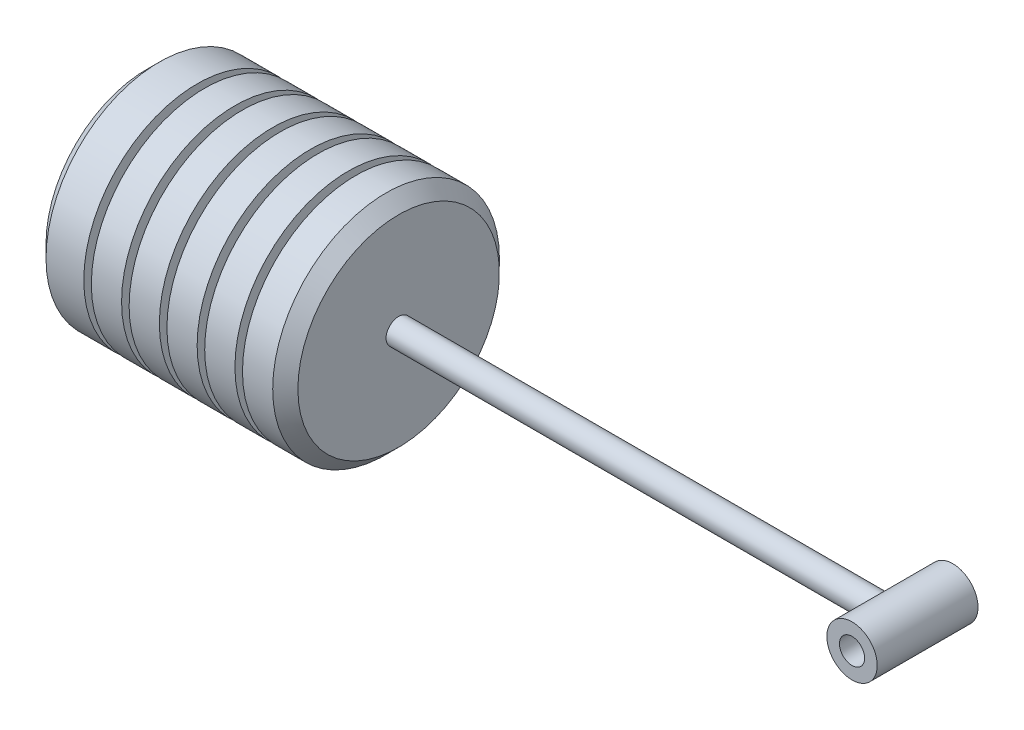
ISO-10303-21;
HEADER;
FILE_DESCRIPTION(('STEP AP214'),'2;1');
FILE_NAME('part.step','',(''),(''),'','','');
FILE_SCHEMA(('AUTOMOTIVE_DESIGN { 1 0 10303 214 1 1 1 1 }'));
ENDSEC;
DATA;
#1=APPLICATION_CONTEXT('core data for automotive mechanical design processes');
#2=APPLICATION_PROTOCOL_DEFINITION('international standard','automotive_design',2000,#1);
#3=PRODUCT_CONTEXT('',#1,'mechanical');
#4=PRODUCT('Part','Part','',(#3));
#5=PRODUCT_RELATED_PRODUCT_CATEGORY('part','',(#4));
#6=PRODUCT_DEFINITION_FORMATION('','',#4);
#7=PRODUCT_DEFINITION_CONTEXT('part definition',#1,'design');
#8=PRODUCT_DEFINITION('design','',#6,#7);
#9=PRODUCT_DEFINITION_SHAPE('','',#8);
#10=(LENGTH_UNIT() NAMED_UNIT(*) SI_UNIT(.MILLI.,.METRE.));
#11=(NAMED_UNIT(*) PLANE_ANGLE_UNIT() SI_UNIT($,.RADIAN.));
#12=(NAMED_UNIT(*) SI_UNIT($,.STERADIAN.) SOLID_ANGLE_UNIT());
#13=UNCERTAINTY_MEASURE_WITH_UNIT(LENGTH_MEASURE(1.E-05),#10,'distance_accuracy_value','');
#14=(GEOMETRIC_REPRESENTATION_CONTEXT(3) GLOBAL_UNCERTAINTY_ASSIGNED_CONTEXT((#13)) GLOBAL_UNIT_ASSIGNED_CONTEXT((#10,
#11,#12)) REPRESENTATION_CONTEXT('',''));
#15=CARTESIAN_POINT('',(0.,0.,0.));
#16=DIRECTION('',(0.,0.,1.));
#17=DIRECTION('',(1.,0.,0.));
#18=AXIS2_PLACEMENT_3D('',#15,#16,#17);
#19=CARTESIAN_POINT('',(300.,0.,0.));
#20=DIRECTION('',(-1.,0.,0.));
#21=DIRECTION('',(0.,0.,1.));
#22=AXIS2_PLACEMENT_3D('',#19,#20,#21);
#23=CYLINDRICAL_SURFACE('',#22,5.);
#24=CARTESIAN_POINT('',(100.,0.,0.));
#25=DIRECTION('',(-1.,0.,0.));
#26=DIRECTION('',(0.,0.,1.));
#27=AXIS2_PLACEMENT_3D('',#24,#25,#26);
#28=CIRCLE('',#27,5.);
#29=CARTESIAN_POINT('',(100.,0.,5.));
#30=VERTEX_POINT('',#29);
#31=EDGE_CURVE('E44',#30,#30,#28,.F.);
#32=ORIENTED_EDGE('',*,*,#31,.T.);
#33=EDGE_LOOP('',(#32));
#34=FACE_BOUND('',#33,.T.);
#35=CARTESIAN_POINT('',(290.,0.,5.));
#36=CARTESIAN_POINT('',(290.000000398281,-0.131488890078726,4.99999956778397));
#37=CARTESIAN_POINT('',(290.002599468787,-0.262986970217147,4.99480722471488));
#38=CARTESIAN_POINT('',(290.012930221648,-0.525014586348051,4.97409710588797));
#39=CARTESIAN_POINT('',(290.020664136851,-0.655543676003291,4.95857483823602));
#40=CARTESIAN_POINT('',(290.04107933031,-0.91478320343113,4.91735922052266));
#41=CARTESIAN_POINT('',(290.053767663571,-1.04349077535257,4.89165136559376));
#42=CARTESIAN_POINT('',(290.083772834233,-1.29802636754292,4.83034932743654));
#43=CARTESIAN_POINT('',(290.101091563696,-1.42385318781692,4.79475110259437));
#44=CARTESIAN_POINT('',(290.139845698452,-1.67121386584966,4.71422151754871));
#45=CARTESIAN_POINT('',(290.161262903292,-1.7927639909456,4.66933135145196));
#46=CARTESIAN_POINT('',(290.207755725107,-2.03144447751189,4.57055120219306));
#47=CARTESIAN_POINT('',(290.232832718532,-2.14857315511665,4.51665783180655));
#48=CARTESIAN_POINT('',(290.312691395113,-2.49222561412914,4.34220037106102));
#49=CARTESIAN_POINT('',(290.372145397838,-2.71128846115303,4.20876922675994));
#50=CARTESIAN_POINT('',(290.502193365758,-3.13758045755123,3.90239471875545));
#51=CARTESIAN_POINT('',(290.573243673287,-3.34329192972867,3.72754930972028));
#52=CARTESIAN_POINT('',(290.716997855248,-3.72388133818108,3.34741091171684));
#53=CARTESIAN_POINT('',(290.789702942565,-3.89873577832563,3.14209493801615));
#54=CARTESIAN_POINT('',(290.93506132667,-4.22628385620055,2.68752485253572));
#55=CARTESIAN_POINT('',(291.007273358297,-4.37620734766694,2.43609810868251));
#56=CARTESIAN_POINT('',(291.103625824533,-4.56723365243868,2.0400819556324));
#57=CARTESIAN_POINT('',(291.133757203153,-4.62527981130998,1.90488170943973));
#58=CARTESIAN_POINT('',(291.188903883728,-4.72948843578257,1.62899874822594));
#59=CARTESIAN_POINT('',(291.21392221298,-4.77565793744269,1.48831933636083));
#60=CARTESIAN_POINT('',(291.256494376379,-4.8531380584616,1.21100724584403));
#61=CARTESIAN_POINT('',(291.274402958911,-4.88516762296958,1.07462952002207));
#62=CARTESIAN_POINT('',(291.304036662889,-4.93772573892405,0.79907430252038));
#63=CARTESIAN_POINT('',(291.315765064848,-4.95826039236648,0.659898336993895));
#64=CARTESIAN_POINT('',(291.33253838913,-4.98752398958936,0.379992538888765));
#65=CARTESIAN_POINT('',(291.337587336507,-4.99626004329765,0.239263693685899));
#66=CARTESIAN_POINT('',(291.340787003611,-5.00180399494055,-0.0425011762896027));
#67=CARTESIAN_POINT('',(291.338938381488,-4.99861303092504,-0.183537170471377));
#68=CARTESIAN_POINT('',(291.329062728264,-4.98145803092846,-0.447703572876945));
#69=CARTESIAN_POINT('',(291.321803364989,-4.96883208371091,-0.570952602810193));
#70=CARTESIAN_POINT('',(291.302260930034,-4.93454402662215,-0.815821213967095));
#71=CARTESIAN_POINT('',(291.289976280537,-4.91287907868334,-0.937440271021929));
#72=CARTESIAN_POINT('',(291.260785204231,-4.86076278292654,-1.17819787431275));
#73=CARTESIAN_POINT('',(291.243879348044,-4.83031251988905,-1.29733672485001));
#74=CARTESIAN_POINT('',(291.205969260154,-4.76094319159974,-1.53247137695438));
#75=CARTESIAN_POINT('',(291.184963418347,-4.72202079856858,-1.64846592327606));
#76=CARTESIAN_POINT('',(291.115639675784,-4.59108661358502,-1.99600687161863));
#77=CARTESIAN_POINT('',(291.061712081665,-4.48608785825887,-2.22169335603785));
#78=CARTESIAN_POINT('',(290.944825669214,-4.24519591002764,-2.65321011822285));
#79=CARTESIAN_POINT('',(290.88186279899,-4.10928884013355,-2.85903141775921));
#80=CARTESIAN_POINT('',(290.744345442409,-3.79034422310329,-3.27258852820379));
#81=CARTESIAN_POINT('',(290.669333457969,-3.60351571642877,-3.47725800770729));
#82=CARTESIAN_POINT('',(290.5226098609,-3.19773444843253,-3.85370346568872));
#83=CARTESIAN_POINT('',(290.450899837942,-2.97876642220598,-4.02546372382122));
#84=CARTESIAN_POINT('',(290.349654934178,-2.62430600098781,-4.25844089711319));
#85=CARTESIAN_POINT('',(290.316296197258,-2.49871002336159,-4.33335209514551));
#86=CARTESIAN_POINT('',(290.253369472815,-2.2407106014256,-4.47220820297243));
#87=CARTESIAN_POINT('',(290.223799888642,-2.1083100575541,-4.53615773559115));
#88=CARTESIAN_POINT('',(290.169324464895,-1.83762803314805,-4.65239887538338));
#89=CARTESIAN_POINT('',(290.144416748551,-1.6993489468218,-4.70469517552479));
#90=CARTESIAN_POINT('',(290.100009735425,-1.41791187896084,-4.79702492907996));
#91=CARTESIAN_POINT('',(290.080509816496,-1.27475446078988,-4.83705979318215));
#92=CARTESIAN_POINT('',(290.048904026718,-0.996798015430421,-4.90153356350301));
#93=CARTESIAN_POINT('',(290.036319536657,-0.862288674029806,-4.92698951540243));
#94=CARTESIAN_POINT('',(290.016569642677,-0.591248360012475,-4.9668080412236));
#95=CARTESIAN_POINT('',(290.009403759718,-0.454717567193961,-4.98117159579009));
#96=CARTESIAN_POINT('',(290.000696195126,-0.180810709359656,-4.99861316203406));
#97=CARTESIAN_POINT('',(289.999152360327,-0.0434349881359083,-5.00169549426692));
#98=CARTESIAN_POINT('',(290.00172762141,0.231047608581543,-4.99654442608125));
#99=CARTESIAN_POINT('',(290.005846466674,0.368154495704333,-4.98831152645069));
#100=CARTESIAN_POINT('',(290.019090269176,0.630324023952241,-4.96172132615896));
#101=CARTESIAN_POINT('',(290.027800777569,0.755493751243217,-4.94420162240662));
#102=CARTESIAN_POINT('',(290.049727726473,1.00380426086804,-4.89982552642939));
#103=CARTESIAN_POINT('',(290.062945594164,1.12694438760007,-4.87296617690675));
#104=CARTESIAN_POINT('',(290.093575495959,1.37032307172126,-4.81019731663748));
#105=CARTESIAN_POINT('',(290.110986246537,1.49056250470176,-4.77429057532187));
#106=CARTESIAN_POINT('',(290.149606318511,1.72747946867538,-4.69377183867682));
#107=CARTESIAN_POINT('',(290.170817094759,1.84415561535681,-4.64915650864734));
#108=CARTESIAN_POINT('',(290.240771235834,2.19430354472275,-4.5000521931497));
#109=CARTESIAN_POINT('',(290.294950955218,2.42111320848944,-4.38205925821493));
#110=CARTESIAN_POINT('',(290.412806242544,2.8523456015808,-4.1144478067803));
#111=CARTESIAN_POINT('',(290.476485852236,3.05675873773467,-3.96481581800768));
#112=CARTESIAN_POINT('',(290.614584946079,3.45882132675026,-3.62121270896337));
#113=CARTESIAN_POINT('',(290.68944500638,3.65383533419946,-3.42433040824756));
#114=CARTESIAN_POINT('',(290.836891182409,4.00930667677967,-3.00032946286605));
#115=CARTESIAN_POINT('',(290.909475695627,4.16974010650665,-2.77319007600167));
#116=CARTESIAN_POINT('',(291.012147394174,4.38466016919211,-2.40750943377074));
#117=CARTESIAN_POINT('',(291.046040447586,4.4532676226712,-2.27814912545652));
#118=CARTESIAN_POINT('',(291.109776475849,4.57918112262684,-2.01310589922103));
#119=CARTESIAN_POINT('',(291.139621283196,4.63649228788887,-1.87742587962409));
#120=CARTESIAN_POINT('',(291.194096726344,4.73913999074898,-1.60072296467478));
#121=CARTESIAN_POINT('',(291.218731620053,4.78448631442401,-1.45970454424997));
#122=CARTESIAN_POINT('',(291.261771809018,4.86265004333096,-1.17330895717519));
#123=CARTESIAN_POINT('',(291.280178068782,4.89546938847111,-1.02793246917246));
#124=CARTESIAN_POINT('',(291.308487243286,4.94553834792943,-0.748235018464724));
#125=CARTESIAN_POINT('',(291.319036729647,4.96397997433445,-0.614192116880048));
#126=CARTESIAN_POINT('',(291.333931754604,4.98993873206133,-0.344714754302618));
#127=CARTESIAN_POINT('',(291.338277943202,4.99745700797003,-0.209280440604789));
#128=CARTESIAN_POINT('',(291.340585743433,5.00145477351748,0.0617569250046245));
#129=CARTESIAN_POINT('',(291.338549599237,4.99793814327599,0.197359900849616));
#130=CARTESIAN_POINT('',(291.328183182142,4.97992974203946,0.467585557947869));
#131=CARTESIAN_POINT('',(291.319853166912,4.96543842034336,0.602208279104529));
#132=CARTESIAN_POINT('',(291.298321712552,4.92759757627216,0.856560202159008));
#133=CARTESIAN_POINT('',(291.285662290912,4.90522766015001,0.976482559623924));
#134=CARTESIAN_POINT('',(291.255884005195,4.85194376743194,1.21386119056747));
#135=CARTESIAN_POINT('',(291.238763762184,4.82102714868723,1.33131668933404));
#136=CARTESIAN_POINT('',(291.181457681313,4.71590306073959,1.6789171151129));
#137=CARTESIAN_POINT('',(291.135311862289,4.62929708984156,1.904456094986));
#138=CARTESIAN_POINT('',(291.028571090454,4.41907164675021,2.35316034231251));
#139=CARTESIAN_POINT('',(290.967213663526,4.29335633682032,2.57514807598934));
#140=CARTESIAN_POINT('',(290.838233635048,4.01075421010745,2.99636410959571));
#141=CARTESIAN_POINT('',(290.770607783796,3.85385117607732,3.19558048344416));
#142=CARTESIAN_POINT('',(290.626885553992,3.49102748964406,3.59070785847071));
#143=CARTESIAN_POINT('',(290.550758370941,3.281467363426,3.78327601876761));
#144=CARTESIAN_POINT('',(290.406104850285,2.83072875767415,4.13133442118327));
#145=CARTESIAN_POINT('',(290.33758262024,2.58953334336126,4.28680467774357));
#146=CARTESIAN_POINT('',(290.245809866242,2.20753881885373,4.48863041452683));
#147=CARTESIAN_POINT('',(290.216957900197,2.0762551257027,4.55086707940638));
#148=CARTESIAN_POINT('',(290.163852547654,1.80799529933998,4.66393615612038));
#149=CARTESIAN_POINT('',(290.13959690292,1.6710220020515,4.71477417053062));
#150=CARTESIAN_POINT('',(290.096455158713,1.39269501068687,4.80434543836719));
#151=CARTESIAN_POINT('',(290.077557356206,1.2513516234708,4.84310509298771));
#152=CARTESIAN_POINT('',(290.04565381888,0.965237205795552,4.90813759626857));
#153=CARTESIAN_POINT('',(290.032644485103,0.820468326048369,4.93441807252704));
#154=CARTESIAN_POINT('',(290.015236121213,0.563041654408156,4.96947453199886));
#155=CARTESIAN_POINT('',(290.009532583983,0.450825809730021,4.98091175369202));
#156=CARTESIAN_POINT('',(290.00191430014,0.225742246050263,4.99617477825015));
#157=CARTESIAN_POINT('',(289.999999658102,0.112874509142187,5.00000037102885));
#158=CARTESIAN_POINT('',(290.,0.,5.));
#159=B_SPLINE_CURVE_WITH_KNOTS('',3,(#35,#36,#37,#38,#39,#40,#41,#42,#43,#44,#45,#46,#47,#48,
#49,#50,#51,#52,#53,#54,#55,#56,#57,#58,#59,#60,#61,#62,#63,#64,#65,#66,#67,#68,#69,#70,#71,#72,
#73,#74,#75,#76,#77,#78,#79,#80,#81,#82,#83,#84,#85,#86,#87,#88,#89,#90,#91,#92,#93,#94,#95,#96,
#97,#98,#99,#100,#101,#102,#103,#104,#105,#106,#107,#108,#109,#110,#111,#112,#113,#114,#115,
#116,#117,#118,#119,#120,#121,#122,#123,#124,#125,#126,#127,#128,#129,#130,#131,#132,#133,#134,
#135,#136,#137,#138,#139,#140,#141,#142,#143,#144,#145,#146,#147,#148,#149,#150,#151,#152,#153,
#154,#155,#156,#157,#158),.UNSPECIFIED.,.T.,.F.,(4,2,2,2,2,2,2,2,2,2,2,2,2,2,2,2,2,2,2,2,2,2,2,
2,2,2,2,2,2,2,2,2,2,2,2,2,2,2,2,2,2,2,2,2,2,2,2,2,2,2,2,2,2,2,2,2,2,2,2,2,2,4),(0.,
0.394355294649885,0.788882184037812,1.18397293369034,1.57922537181693,1.9727616853054,
2.36644639154632,3.15295441699266,3.98704440767527,4.82176680235501,5.72122193562247,
6.17125359989459,6.62101803579305,7.04410338623952,7.46696393118358,7.88956954321097,
8.31213483216671,8.68401534897462,9.05601271689167,9.42796417149683,9.8000619899096,
10.56083380205,11.3219478566368,12.1795688603196,13.03759852356,13.4870830845772,
13.9363776171859,14.3854908824167,14.8345524573652,15.2464230691107,15.6582572644723,
16.0699337163998,16.4815919489941,16.8612200640511,17.240968493866,17.6206008225791,
18.0003788066131,18.7808755264614,19.5617052624835,20.4192132572739,21.2773121558255,
21.7277011924366,22.1778856687596,22.6277007885002,23.0774462222894,23.4840267197959,
23.8905646113036,24.2969595710184,24.703337894006,25.0708552370355,25.4384863225851,
26.1732662495599,26.9574126491567,27.7419678673239,28.6218519479817,29.5022089791541,
29.9460734671028,30.3897193096444,30.8323885049027,31.2747867798493,31.6133053554877,
31.9518332743451),.UNSPECIFIED.);
#160=CARTESIAN_POINT('',(290.,0.,5.));
#161=VERTEX_POINT('',#160);
#162=EDGE_CURVE('E10',#161,#161,#159,.T.);
#163=ORIENTED_EDGE('',*,*,#162,.F.);
#164=EDGE_LOOP('',(#163));
#165=FACE_BOUND('',#164,.T.);
#166=ADVANCED_FACE('F33',(#34,#165),#23,.T.);
#167=CARTESIAN_POINT('',(0.,0.,0.));
#168=DIRECTION('',(1.,0.,0.));
#169=DIRECTION('',(0.,0.,-1.));
#170=AXIS2_PLACEMENT_3D('',#167,#168,#169);
#171=PLANE('',#170);
#172=CARTESIAN_POINT('',(0.,0.,0.));
#173=DIRECTION('',(-1.,0.,0.));
#174=DIRECTION('',(0.,0.,1.));
#175=AXIS2_PLACEMENT_3D('',#172,#173,#174);
#176=CIRCLE('',#175,40.);
#177=CARTESIAN_POINT('',(0.,0.,40.));
#178=VERTEX_POINT('',#177);
#179=EDGE_CURVE('E48',#178,#178,#176,.T.);
#180=ORIENTED_EDGE('',*,*,#179,.T.);
#181=EDGE_LOOP('',(#180));
#182=FACE_BOUND('',#181,.T.);
#183=ADVANCED_FACE('F35',(#182),#171,.F.);
#184=CARTESIAN_POINT('',(5.,0.,0.));
#185=DIRECTION('',(1.,0.,0.));
#186=DIRECTION('',(0.,0.,-1.));
#187=AXIS2_PLACEMENT_3D('',#184,#185,#186);
#188=CONICAL_SURFACE('',#187,45.,0.785398163397448);
#189=ORIENTED_EDGE('',*,*,#179,.F.);
#190=EDGE_LOOP('',(#189));
#191=FACE_BOUND('',#190,.T.);
#192=CARTESIAN_POINT('',(5.,0.,0.));
#193=DIRECTION('',(-1.,0.,0.));
#194=DIRECTION('',(0.,0.,1.));
#195=AXIS2_PLACEMENT_3D('',#192,#193,#194);
#196=CIRCLE('',#195,45.);
#197=CARTESIAN_POINT('',(5.,0.,45.));
#198=VERTEX_POINT('',#197);
#199=EDGE_CURVE('E52',#198,#198,#196,.T.);
#200=ORIENTED_EDGE('',*,*,#199,.T.);
#201=EDGE_LOOP('',(#200));
#202=FACE_BOUND('',#201,.T.);
#203=ADVANCED_FACE('F162',(#191,#202),#188,.T.);
#204=CARTESIAN_POINT('',(-82.8620689655173,0.,0.));
#205=DIRECTION('',(-1.,0.,0.));
#206=DIRECTION('',(0.,0.,1.));
#207=AXIS2_PLACEMENT_3D('',#204,#205,#206);
#208=CYLINDRICAL_SURFACE('',#207,45.);
#209=ORIENTED_EDGE('',*,*,#199,.F.);
#210=EDGE_LOOP('',(#209));
#211=FACE_BOUND('',#210,.T.);
#212=CARTESIAN_POINT('',(20.,0.,0.));
#213=DIRECTION('',(-1.,0.,0.));
#214=DIRECTION('',(0.,0.,1.));
#215=AXIS2_PLACEMENT_3D('',#212,#213,#214);
#216=CIRCLE('',#215,45.);
#217=CARTESIAN_POINT('',(20.,0.,45.));
#218=VERTEX_POINT('',#217);
#219=EDGE_CURVE('E57',#218,#218,#216,.T.);
#220=ORIENTED_EDGE('',*,*,#219,.T.);
#221=EDGE_LOOP('',(#220));
#222=FACE_BOUND('',#221,.T.);
#223=ADVANCED_FACE('F249',(#211,#222),#208,.T.);
#224=CARTESIAN_POINT('',(20.,45.,0.));
#225=DIRECTION('',(-1.,0.,0.));
#226=DIRECTION('',(0.,0.,1.));
#227=AXIS2_PLACEMENT_3D('',#224,#225,#226);
#228=PLANE('',#227);
#229=ORIENTED_EDGE('',*,*,#219,.F.);
#230=EDGE_LOOP('',(#229));
#231=FACE_BOUND('',#230,.T.);
#232=CARTESIAN_POINT('',(20.,0.,0.));
#233=DIRECTION('',(-1.,0.,0.));
#234=DIRECTION('',(0.,0.,1.));
#235=AXIS2_PLACEMENT_3D('',#232,#233,#234);
#236=CIRCLE('',#235,40.);
#237=CARTESIAN_POINT('',(20.,0.,40.));
#238=VERTEX_POINT('',#237);
#239=EDGE_CURVE('E60',#238,#238,#236,.T.);
#240=ORIENTED_EDGE('',*,*,#239,.T.);
#241=EDGE_LOOP('',(#240));
#242=FACE_BOUND('',#241,.T.);
#243=ADVANCED_FACE('F245',(#231,#242),#228,.F.);
#244=CARTESIAN_POINT('',(-82.8620689655173,0.,0.));
#245=DIRECTION('',(-1.,0.,0.));
#246=DIRECTION('',(0.,0.,1.));
#247=AXIS2_PLACEMENT_3D('',#244,#245,#246);
#248=CYLINDRICAL_SURFACE('',#247,40.);
#249=ORIENTED_EDGE('',*,*,#239,.F.);
#250=EDGE_LOOP('',(#249));
#251=FACE_BOUND('',#250,.T.);
#252=CARTESIAN_POINT('',(23.,0.,0.));
#253=DIRECTION('',(-1.,0.,0.));
#254=DIRECTION('',(0.,0.,1.));
#255=AXIS2_PLACEMENT_3D('',#252,#253,#254);
#256=CIRCLE('',#255,40.);
#257=CARTESIAN_POINT('',(23.,0.,40.));
#258=VERTEX_POINT('',#257);
#259=EDGE_CURVE('E63',#258,#258,#256,.T.);
#260=ORIENTED_EDGE('',*,*,#259,.T.);
#261=EDGE_LOOP('',(#260));
#262=FACE_BOUND('',#261,.T.);
#263=ADVANCED_FACE('F241',(#251,#262),#248,.T.);
#264=CARTESIAN_POINT('',(23.,40.,0.));
#265=DIRECTION('',(1.,0.,0.));
#266=DIRECTION('',(0.,0.,-1.));
#267=AXIS2_PLACEMENT_3D('',#264,#265,#266);
#268=PLANE('',#267);
#269=ORIENTED_EDGE('',*,*,#259,.F.);
#270=EDGE_LOOP('',(#269));
#271=FACE_BOUND('',#270,.T.);
#272=CARTESIAN_POINT('',(23.,0.,0.));
#273=DIRECTION('',(-1.,0.,0.));
#274=DIRECTION('',(0.,0.,1.));
#275=AXIS2_PLACEMENT_3D('',#272,#273,#274);
#276=CIRCLE('',#275,45.);
#277=CARTESIAN_POINT('',(23.,0.,45.));
#278=VERTEX_POINT('',#277);
#279=EDGE_CURVE('E66',#278,#278,#276,.T.);
#280=ORIENTED_EDGE('',*,*,#279,.T.);
#281=EDGE_LOOP('',(#280));
#282=FACE_BOUND('',#281,.T.);
#283=ADVANCED_FACE('F237',(#271,#282),#268,.F.);
#284=CARTESIAN_POINT('',(-82.8620689655173,0.,0.));
#285=DIRECTION('',(-1.,0.,0.));
#286=DIRECTION('',(0.,0.,1.));
#287=AXIS2_PLACEMENT_3D('',#284,#285,#286);
#288=CYLINDRICAL_SURFACE('',#287,45.);
#289=ORIENTED_EDGE('',*,*,#279,.F.);
#290=EDGE_LOOP('',(#289));
#291=FACE_BOUND('',#290,.T.);
#292=CARTESIAN_POINT('',(35.,0.,0.));
#293=DIRECTION('',(-1.,0.,0.));
#294=DIRECTION('',(0.,0.,1.));
#295=AXIS2_PLACEMENT_3D('',#292,#293,#294);
#296=CIRCLE('',#295,45.);
#297=CARTESIAN_POINT('',(35.,0.,45.));
#298=VERTEX_POINT('',#297);
#299=EDGE_CURVE('E69',#298,#298,#296,.T.);
#300=ORIENTED_EDGE('',*,*,#299,.T.);
#301=EDGE_LOOP('',(#300));
#302=FACE_BOUND('',#301,.T.);
#303=ADVANCED_FACE('F233',(#291,#302),#288,.T.);
#304=CARTESIAN_POINT('',(35.,45.,0.));
#305=DIRECTION('',(-1.,0.,0.));
#306=DIRECTION('',(0.,0.,1.));
#307=AXIS2_PLACEMENT_3D('',#304,#305,#306);
#308=PLANE('',#307);
#309=ORIENTED_EDGE('',*,*,#299,.F.);
#310=EDGE_LOOP('',(#309));
#311=FACE_BOUND('',#310,.T.);
#312=CARTESIAN_POINT('',(35.,0.,0.));
#313=DIRECTION('',(-1.,0.,0.));
#314=DIRECTION('',(0.,0.,1.));
#315=AXIS2_PLACEMENT_3D('',#312,#313,#314);
#316=CIRCLE('',#315,40.);
#317=CARTESIAN_POINT('',(35.,0.,40.));
#318=VERTEX_POINT('',#317);
#319=EDGE_CURVE('E72',#318,#318,#316,.T.);
#320=ORIENTED_EDGE('',*,*,#319,.T.);
#321=EDGE_LOOP('',(#320));
#322=FACE_BOUND('',#321,.T.);
#323=ADVANCED_FACE('F229',(#311,#322),#308,.F.);
#324=CARTESIAN_POINT('',(-82.8620689655173,0.,0.));
#325=DIRECTION('',(-1.,0.,0.));
#326=DIRECTION('',(0.,0.,1.));
#327=AXIS2_PLACEMENT_3D('',#324,#325,#326);
#328=CYLINDRICAL_SURFACE('',#327,40.);
#329=ORIENTED_EDGE('',*,*,#319,.F.);
#330=EDGE_LOOP('',(#329));
#331=FACE_BOUND('',#330,.T.);
#332=CARTESIAN_POINT('',(38.,0.,0.));
#333=DIRECTION('',(-1.,0.,0.));
#334=DIRECTION('',(0.,0.,1.));
#335=AXIS2_PLACEMENT_3D('',#332,#333,#334);
#336=CIRCLE('',#335,40.);
#337=CARTESIAN_POINT('',(38.,0.,40.));
#338=VERTEX_POINT('',#337);
#339=EDGE_CURVE('E75',#338,#338,#336,.T.);
#340=ORIENTED_EDGE('',*,*,#339,.T.);
#341=EDGE_LOOP('',(#340));
#342=FACE_BOUND('',#341,.T.);
#343=ADVANCED_FACE('F225',(#331,#342),#328,.T.);
#344=CARTESIAN_POINT('',(38.,40.,0.));
#345=DIRECTION('',(1.,0.,0.));
#346=DIRECTION('',(0.,0.,-1.));
#347=AXIS2_PLACEMENT_3D('',#344,#345,#346);
#348=PLANE('',#347);
#349=ORIENTED_EDGE('',*,*,#339,.F.);
#350=EDGE_LOOP('',(#349));
#351=FACE_BOUND('',#350,.T.);
#352=CARTESIAN_POINT('',(38.,0.,0.));
#353=DIRECTION('',(-1.,0.,0.));
#354=DIRECTION('',(0.,0.,1.));
#355=AXIS2_PLACEMENT_3D('',#352,#353,#354);
#356=CIRCLE('',#355,45.);
#357=CARTESIAN_POINT('',(38.,0.,45.));
#358=VERTEX_POINT('',#357);
#359=EDGE_CURVE('E78',#358,#358,#356,.T.);
#360=ORIENTED_EDGE('',*,*,#359,.T.);
#361=EDGE_LOOP('',(#360));
#362=FACE_BOUND('',#361,.T.);
#363=ADVANCED_FACE('F221',(#351,#362),#348,.F.);
#364=CARTESIAN_POINT('',(-82.8620689655173,0.,0.));
#365=DIRECTION('',(-1.,0.,0.));
#366=DIRECTION('',(0.,0.,1.));
#367=AXIS2_PLACEMENT_3D('',#364,#365,#366);
#368=CYLINDRICAL_SURFACE('',#367,45.);
#369=ORIENTED_EDGE('',*,*,#359,.F.);
#370=EDGE_LOOP('',(#369));
#371=FACE_BOUND('',#370,.T.);
#372=CARTESIAN_POINT('',(50.,0.,0.));
#373=DIRECTION('',(-1.,0.,0.));
#374=DIRECTION('',(0.,0.,1.));
#375=AXIS2_PLACEMENT_3D('',#372,#373,#374);
#376=CIRCLE('',#375,45.);
#377=CARTESIAN_POINT('',(50.,0.,45.));
#378=VERTEX_POINT('',#377);
#379=EDGE_CURVE('E81',#378,#378,#376,.T.);
#380=ORIENTED_EDGE('',*,*,#379,.T.);
#381=EDGE_LOOP('',(#380));
#382=FACE_BOUND('',#381,.T.);
#383=ADVANCED_FACE('F217',(#371,#382),#368,.T.);
#384=CARTESIAN_POINT('',(50.,45.,0.));
#385=DIRECTION('',(-1.,0.,0.));
#386=DIRECTION('',(0.,0.,1.));
#387=AXIS2_PLACEMENT_3D('',#384,#385,#386);
#388=PLANE('',#387);
#389=ORIENTED_EDGE('',*,*,#379,.F.);
#390=EDGE_LOOP('',(#389));
#391=FACE_BOUND('',#390,.T.);
#392=CARTESIAN_POINT('',(50.,0.,0.));
#393=DIRECTION('',(-1.,0.,0.));
#394=DIRECTION('',(0.,0.,1.));
#395=AXIS2_PLACEMENT_3D('',#392,#393,#394);
#396=CIRCLE('',#395,40.);
#397=CARTESIAN_POINT('',(50.,0.,40.));
#398=VERTEX_POINT('',#397);
#399=EDGE_CURVE('E84',#398,#398,#396,.T.);
#400=ORIENTED_EDGE('',*,*,#399,.T.);
#401=EDGE_LOOP('',(#400));
#402=FACE_BOUND('',#401,.T.);
#403=ADVANCED_FACE('F213',(#391,#402),#388,.F.);
#404=CARTESIAN_POINT('',(-82.8620689655173,0.,0.));
#405=DIRECTION('',(-1.,0.,0.));
#406=DIRECTION('',(0.,0.,1.));
#407=AXIS2_PLACEMENT_3D('',#404,#405,#406);
#408=CYLINDRICAL_SURFACE('',#407,40.);
#409=ORIENTED_EDGE('',*,*,#399,.F.);
#410=EDGE_LOOP('',(#409));
#411=FACE_BOUND('',#410,.T.);
#412=CARTESIAN_POINT('',(53.,0.,0.));
#413=DIRECTION('',(-1.,0.,0.));
#414=DIRECTION('',(0.,0.,1.));
#415=AXIS2_PLACEMENT_3D('',#412,#413,#414);
#416=CIRCLE('',#415,40.);
#417=CARTESIAN_POINT('',(53.,0.,40.));
#418=VERTEX_POINT('',#417);
#419=EDGE_CURVE('E87',#418,#418,#416,.T.);
#420=ORIENTED_EDGE('',*,*,#419,.T.);
#421=EDGE_LOOP('',(#420));
#422=FACE_BOUND('',#421,.T.);
#423=ADVANCED_FACE('F209',(#411,#422),#408,.T.);
#424=CARTESIAN_POINT('',(53.,40.,0.));
#425=DIRECTION('',(1.,0.,0.));
#426=DIRECTION('',(0.,0.,-1.));
#427=AXIS2_PLACEMENT_3D('',#424,#425,#426);
#428=PLANE('',#427);
#429=ORIENTED_EDGE('',*,*,#419,.F.);
#430=EDGE_LOOP('',(#429));
#431=FACE_BOUND('',#430,.T.);
#432=CARTESIAN_POINT('',(53.,0.,0.));
#433=DIRECTION('',(-1.,0.,0.));
#434=DIRECTION('',(0.,0.,1.));
#435=AXIS2_PLACEMENT_3D('',#432,#433,#434);
#436=CIRCLE('',#435,45.);
#437=CARTESIAN_POINT('',(53.,0.,45.));
#438=VERTEX_POINT('',#437);
#439=EDGE_CURVE('E90',#438,#438,#436,.T.);
#440=ORIENTED_EDGE('',*,*,#439,.T.);
#441=EDGE_LOOP('',(#440));
#442=FACE_BOUND('',#441,.T.);
#443=ADVANCED_FACE('F205',(#431,#442),#428,.F.);
#444=CARTESIAN_POINT('',(-82.8620689655173,0.,0.));
#445=DIRECTION('',(-1.,0.,0.));
#446=DIRECTION('',(0.,0.,1.));
#447=AXIS2_PLACEMENT_3D('',#444,#445,#446);
#448=CYLINDRICAL_SURFACE('',#447,45.);
#449=ORIENTED_EDGE('',*,*,#439,.F.);
#450=EDGE_LOOP('',(#449));
#451=FACE_BOUND('',#450,.T.);
#452=CARTESIAN_POINT('',(65.,0.,0.));
#453=DIRECTION('',(-1.,0.,0.));
#454=DIRECTION('',(0.,0.,1.));
#455=AXIS2_PLACEMENT_3D('',#452,#453,#454);
#456=CIRCLE('',#455,45.);
#457=CARTESIAN_POINT('',(65.,0.,45.));
#458=VERTEX_POINT('',#457);
#459=EDGE_CURVE('E93',#458,#458,#456,.T.);
#460=ORIENTED_EDGE('',*,*,#459,.T.);
#461=EDGE_LOOP('',(#460));
#462=FACE_BOUND('',#461,.T.);
#463=ADVANCED_FACE('F201',(#451,#462),#448,.T.);
#464=CARTESIAN_POINT('',(65.,45.,0.));
#465=DIRECTION('',(-1.,0.,0.));
#466=DIRECTION('',(0.,0.,1.));
#467=AXIS2_PLACEMENT_3D('',#464,#465,#466);
#468=PLANE('',#467);
#469=ORIENTED_EDGE('',*,*,#459,.F.);
#470=EDGE_LOOP('',(#469));
#471=FACE_BOUND('',#470,.T.);
#472=CARTESIAN_POINT('',(65.,0.,0.));
#473=DIRECTION('',(-1.,0.,0.));
#474=DIRECTION('',(0.,0.,1.));
#475=AXIS2_PLACEMENT_3D('',#472,#473,#474);
#476=CIRCLE('',#475,40.);
#477=CARTESIAN_POINT('',(65.,0.,40.));
#478=VERTEX_POINT('',#477);
#479=EDGE_CURVE('E96',#478,#478,#476,.T.);
#480=ORIENTED_EDGE('',*,*,#479,.T.);
#481=EDGE_LOOP('',(#480));
#482=FACE_BOUND('',#481,.T.);
#483=ADVANCED_FACE('F197',(#471,#482),#468,.F.);
#484=CARTESIAN_POINT('',(-82.8620689655173,0.,0.));
#485=DIRECTION('',(-1.,0.,0.));
#486=DIRECTION('',(0.,0.,1.));
#487=AXIS2_PLACEMENT_3D('',#484,#485,#486);
#488=CYLINDRICAL_SURFACE('',#487,40.);
#489=ORIENTED_EDGE('',*,*,#479,.F.);
#490=EDGE_LOOP('',(#489));
#491=FACE_BOUND('',#490,.T.);
#492=CARTESIAN_POINT('',(68.,0.,0.));
#493=DIRECTION('',(-1.,0.,0.));
#494=DIRECTION('',(0.,0.,1.));
#495=AXIS2_PLACEMENT_3D('',#492,#493,#494);
#496=CIRCLE('',#495,40.);
#497=CARTESIAN_POINT('',(68.,0.,40.));
#498=VERTEX_POINT('',#497);
#499=EDGE_CURVE('E99',#498,#498,#496,.T.);
#500=ORIENTED_EDGE('',*,*,#499,.T.);
#501=EDGE_LOOP('',(#500));
#502=FACE_BOUND('',#501,.T.);
#503=ADVANCED_FACE('F193',(#491,#502),#488,.T.);
#504=CARTESIAN_POINT('',(68.,40.,0.));
#505=DIRECTION('',(1.,0.,0.));
#506=DIRECTION('',(0.,0.,-1.));
#507=AXIS2_PLACEMENT_3D('',#504,#505,#506);
#508=PLANE('',#507);
#509=ORIENTED_EDGE('',*,*,#499,.F.);
#510=EDGE_LOOP('',(#509));
#511=FACE_BOUND('',#510,.T.);
#512=CARTESIAN_POINT('',(68.,0.,0.));
#513=DIRECTION('',(-1.,0.,0.));
#514=DIRECTION('',(0.,0.,1.));
#515=AXIS2_PLACEMENT_3D('',#512,#513,#514);
#516=CIRCLE('',#515,45.);
#517=CARTESIAN_POINT('',(68.,0.,45.));
#518=VERTEX_POINT('',#517);
#519=EDGE_CURVE('E102',#518,#518,#516,.T.);
#520=ORIENTED_EDGE('',*,*,#519,.T.);
#521=EDGE_LOOP('',(#520));
#522=FACE_BOUND('',#521,.T.);
#523=ADVANCED_FACE('F189',(#511,#522),#508,.F.);
#524=CARTESIAN_POINT('',(-82.8620689655173,0.,0.));
#525=DIRECTION('',(-1.,0.,0.));
#526=DIRECTION('',(0.,0.,1.));
#527=AXIS2_PLACEMENT_3D('',#524,#525,#526);
#528=CYLINDRICAL_SURFACE('',#527,45.);
#529=ORIENTED_EDGE('',*,*,#519,.F.);
#530=EDGE_LOOP('',(#529));
#531=FACE_BOUND('',#530,.T.);
#532=CARTESIAN_POINT('',(80.,0.,0.));
#533=DIRECTION('',(-1.,0.,0.));
#534=DIRECTION('',(0.,0.,1.));
#535=AXIS2_PLACEMENT_3D('',#532,#533,#534);
#536=CIRCLE('',#535,45.);
#537=CARTESIAN_POINT('',(80.,0.,45.));
#538=VERTEX_POINT('',#537);
#539=EDGE_CURVE('E105',#538,#538,#536,.T.);
#540=ORIENTED_EDGE('',*,*,#539,.T.);
#541=EDGE_LOOP('',(#540));
#542=FACE_BOUND('',#541,.T.);
#543=ADVANCED_FACE('F185',(#531,#542),#528,.T.);
#544=CARTESIAN_POINT('',(80.,45.,0.));
#545=DIRECTION('',(-1.,0.,0.));
#546=DIRECTION('',(0.,0.,1.));
#547=AXIS2_PLACEMENT_3D('',#544,#545,#546);
#548=PLANE('',#547);
#549=ORIENTED_EDGE('',*,*,#539,.F.);
#550=EDGE_LOOP('',(#549));
#551=FACE_BOUND('',#550,.T.);
#552=CARTESIAN_POINT('',(80.,0.,0.));
#553=DIRECTION('',(-1.,0.,0.));
#554=DIRECTION('',(0.,0.,1.));
#555=AXIS2_PLACEMENT_3D('',#552,#553,#554);
#556=CIRCLE('',#555,40.);
#557=CARTESIAN_POINT('',(80.,0.,40.));
#558=VERTEX_POINT('',#557);
#559=EDGE_CURVE('E108',#558,#558,#556,.T.);
#560=ORIENTED_EDGE('',*,*,#559,.T.);
#561=EDGE_LOOP('',(#560));
#562=FACE_BOUND('',#561,.T.);
#563=ADVANCED_FACE('F181',(#551,#562),#548,.F.);
#564=CARTESIAN_POINT('',(-82.8620689655173,0.,0.));
#565=DIRECTION('',(-1.,0.,0.));
#566=DIRECTION('',(0.,0.,1.));
#567=AXIS2_PLACEMENT_3D('',#564,#565,#566);
#568=CYLINDRICAL_SURFACE('',#567,40.);
#569=ORIENTED_EDGE('',*,*,#559,.F.);
#570=EDGE_LOOP('',(#569));
#571=FACE_BOUND('',#570,.T.);
#572=CARTESIAN_POINT('',(83.,0.,0.));
#573=DIRECTION('',(-1.,0.,0.));
#574=DIRECTION('',(0.,0.,1.));
#575=AXIS2_PLACEMENT_3D('',#572,#573,#574);
#576=CIRCLE('',#575,40.);
#577=CARTESIAN_POINT('',(83.,0.,40.));
#578=VERTEX_POINT('',#577);
#579=EDGE_CURVE('E111',#578,#578,#576,.T.);
#580=ORIENTED_EDGE('',*,*,#579,.T.);
#581=EDGE_LOOP('',(#580));
#582=FACE_BOUND('',#581,.T.);
#583=ADVANCED_FACE('F177',(#571,#582),#568,.T.);
#584=CARTESIAN_POINT('',(83.,40.,0.));
#585=DIRECTION('',(1.,0.,0.));
#586=DIRECTION('',(0.,0.,-1.));
#587=AXIS2_PLACEMENT_3D('',#584,#585,#586);
#588=PLANE('',#587);
#589=ORIENTED_EDGE('',*,*,#579,.F.);
#590=EDGE_LOOP('',(#589));
#591=FACE_BOUND('',#590,.T.);
#592=CARTESIAN_POINT('',(83.,0.,0.));
#593=DIRECTION('',(-1.,0.,0.));
#594=DIRECTION('',(0.,0.,1.));
#595=AXIS2_PLACEMENT_3D('',#592,#593,#594);
#596=CIRCLE('',#595,45.);
#597=CARTESIAN_POINT('',(83.,0.,45.));
#598=VERTEX_POINT('',#597);
#599=EDGE_CURVE('E114',#598,#598,#596,.T.);
#600=ORIENTED_EDGE('',*,*,#599,.T.);
#601=EDGE_LOOP('',(#600));
#602=FACE_BOUND('',#601,.T.);
#603=ADVANCED_FACE('F173',(#591,#602),#588,.F.);
#604=CARTESIAN_POINT('',(-82.8620689655173,0.,0.));
#605=DIRECTION('',(-1.,0.,0.));
#606=DIRECTION('',(0.,0.,1.));
#607=AXIS2_PLACEMENT_3D('',#604,#605,#606);
#608=CYLINDRICAL_SURFACE('',#607,45.);
#609=ORIENTED_EDGE('',*,*,#599,.F.);
#610=EDGE_LOOP('',(#609));
#611=FACE_BOUND('',#610,.T.);
#612=CARTESIAN_POINT('',(95.,0.,0.));
#613=DIRECTION('',(-1.,0.,0.));
#614=DIRECTION('',(0.,0.,1.));
#615=AXIS2_PLACEMENT_3D('',#612,#613,#614);
#616=CIRCLE('',#615,45.);
#617=CARTESIAN_POINT('',(95.,0.,45.));
#618=VERTEX_POINT('',#617);
#619=EDGE_CURVE('E117',#618,#618,#616,.T.);
#620=ORIENTED_EDGE('',*,*,#619,.T.);
#621=EDGE_LOOP('',(#620));
#622=FACE_BOUND('',#621,.T.);
#623=ADVANCED_FACE('F169',(#611,#622),#608,.T.);
#624=CARTESIAN_POINT('',(100.,0.,0.));
#625=DIRECTION('',(-1.,0.,0.));
#626=DIRECTION('',(0.,0.,1.));
#627=AXIS2_PLACEMENT_3D('',#624,#625,#626);
#628=CONICAL_SURFACE('',#627,40.,0.785398163397448);
#629=ORIENTED_EDGE('',*,*,#619,.F.);
#630=EDGE_LOOP('',(#629));
#631=FACE_BOUND('',#630,.T.);
#632=CARTESIAN_POINT('',(100.,0.,0.));
#633=DIRECTION('',(-1.,0.,0.));
#634=DIRECTION('',(0.,0.,1.));
#635=AXIS2_PLACEMENT_3D('',#632,#633,#634);
#636=CIRCLE('',#635,40.);
#637=CARTESIAN_POINT('',(100.,0.,40.));
#638=VERTEX_POINT('',#637);
#639=EDGE_CURVE('E120',#638,#638,#636,.T.);
#640=ORIENTED_EDGE('',*,*,#639,.T.);
#641=EDGE_LOOP('',(#640));
#642=FACE_BOUND('',#641,.T.);
#643=ADVANCED_FACE('F153',(#631,#642),#628,.T.);
#644=CARTESIAN_POINT('',(100.,0.,0.));
#645=DIRECTION('',(-1.,0.,0.));
#646=DIRECTION('',(0.,0.,1.));
#647=AXIS2_PLACEMENT_3D('',#644,#645,#646);
#648=PLANE('',#647);
#649=ORIENTED_EDGE('',*,*,#31,.F.);
#650=EDGE_LOOP('',(#649));
#651=FACE_BOUND('',#650,.T.);
#652=ORIENTED_EDGE('',*,*,#639,.F.);
#653=EDGE_LOOP('',(#652));
#654=FACE_BOUND('',#653,.T.);
#655=ADVANCED_FACE('F147',(#651,#654),#648,.F.);
#656=CARTESIAN_POINT('',(300.,0.,20.));
#657=DIRECTION('',(0.,0.,-1.));
#658=DIRECTION('',(-1.,0.,0.));
#659=AXIS2_PLACEMENT_3D('',#656,#657,#658);
#660=CYLINDRICAL_SURFACE('',#659,9.99999999999998);
#661=CARTESIAN_POINT('',(300.,0.,-20.));
#662=DIRECTION('',(0.,0.,1.));
#663=DIRECTION('',(1.,0.,0.));
#664=AXIS2_PLACEMENT_3D('',#661,#662,#663);
#665=CIRCLE('',#664,9.99999999999998);
#666=CARTESIAN_POINT('',(310.,0.,-20.));
#667=VERTEX_POINT('',#666);
#668=EDGE_CURVE('E124',#667,#667,#665,.T.);
#669=ORIENTED_EDGE('',*,*,#668,.T.);
#670=EDGE_LOOP('',(#669));
#671=FACE_BOUND('',#670,.T.);
#672=CARTESIAN_POINT('',(300.,0.,20.));
#673=DIRECTION('',(0.,0.,1.));
#674=DIRECTION('',(1.,0.,0.));
#675=AXIS2_PLACEMENT_3D('',#672,#673,#674);
#676=CIRCLE('',#675,9.99999999999998);
#677=CARTESIAN_POINT('',(310.,0.,20.));
#678=VERTEX_POINT('',#677);
#679=EDGE_CURVE('E123',#678,#678,#676,.T.);
#680=ORIENTED_EDGE('',*,*,#679,.F.);
#681=EDGE_LOOP('',(#680));
#682=FACE_BOUND('',#681,.T.);
#683=ORIENTED_EDGE('',*,*,#162,.T.);
#684=EDGE_LOOP('',(#683));
#685=FACE_BOUND('',#684,.T.);
#686=ADVANCED_FACE('F142',(#671,#682,#685),#660,.T.);
#687=CARTESIAN_POINT('',(300.,0.,20.));
#688=DIRECTION('',(0.,0.,1.));
#689=DIRECTION('',(1.,0.,0.));
#690=AXIS2_PLACEMENT_3D('',#687,#688,#689);
#691=PLANE('',#690);
#692=CARTESIAN_POINT('',(300.,0.,20.));
#693=DIRECTION('',(0.,0.,1.));
#694=DIRECTION('',(1.,0.,0.));
#695=AXIS2_PLACEMENT_3D('',#692,#693,#694);
#696=CIRCLE('',#695,5.00000000000005);
#697=CARTESIAN_POINT('',(305.,0.,20.));
#698=VERTEX_POINT('',#697);
#699=EDGE_CURVE('E132',#698,#698,#696,.T.);
#700=ORIENTED_EDGE('',*,*,#699,.F.);
#701=EDGE_LOOP('',(#700));
#702=FACE_BOUND('',#701,.T.);
#703=ORIENTED_EDGE('',*,*,#679,.T.);
#704=EDGE_LOOP('',(#703));
#705=FACE_BOUND('',#704,.T.);
#706=ADVANCED_FACE('F138',(#702,#705),#691,.T.);
#707=CARTESIAN_POINT('',(300.,0.,-20.));
#708=DIRECTION('',(0.,0.,1.));
#709=DIRECTION('',(1.,0.,0.));
#710=AXIS2_PLACEMENT_3D('',#707,#708,#709);
#711=PLANE('',#710);
#712=CARTESIAN_POINT('',(300.,0.,-20.));
#713=DIRECTION('',(0.,0.,1.));
#714=DIRECTION('',(1.,0.,0.));
#715=AXIS2_PLACEMENT_3D('',#712,#713,#714);
#716=CIRCLE('',#715,5.00000000000005);
#717=CARTESIAN_POINT('',(305.,0.,-20.));
#718=VERTEX_POINT('',#717);
#719=EDGE_CURVE('E127',#718,#718,#716,.F.);
#720=ORIENTED_EDGE('',*,*,#719,.F.);
#721=EDGE_LOOP('',(#720));
#722=FACE_BOUND('',#721,.T.);
#723=ORIENTED_EDGE('',*,*,#668,.F.);
#724=EDGE_LOOP('',(#723));
#725=FACE_BOUND('',#724,.T.);
#726=ADVANCED_FACE('F141',(#722,#725),#711,.F.);
#727=CARTESIAN_POINT('',(300.,0.,-34.1421356237311));
#728=DIRECTION('',(0.,0.,1.));
#729=DIRECTION('',(1.,0.,0.));
#730=AXIS2_PLACEMENT_3D('',#727,#728,#729);
#731=CYLINDRICAL_SURFACE('',#730,5.00000000000005);
#732=ORIENTED_EDGE('',*,*,#719,.T.);
#733=EDGE_LOOP('',(#732));
#734=FACE_BOUND('',#733,.T.);
#735=ORIENTED_EDGE('',*,*,#699,.T.);
#736=EDGE_LOOP('',(#735));
#737=FACE_BOUND('',#736,.T.);
#738=ADVANCED_FACE('F136',(#734,#737),#731,.F.);
#739=CLOSED_SHELL('',(#166,#183,#203,#223,#243,#263,#283,#303,#323,#343,#363,#383,#403,#423,
#443,#463,#483,#503,#523,#543,#563,#583,#603,#623,#643,#655,#686,#706,#726,#738));
#740=MANIFOLD_SOLID_BREP('B2',#739);
#741=ADVANCED_BREP_SHAPE_REPRESENTATION('',(#18,#740),#14);
#742=SHAPE_DEFINITION_REPRESENTATION(#9,#741);
ENDSEC;
END-ISO-10303-21;
